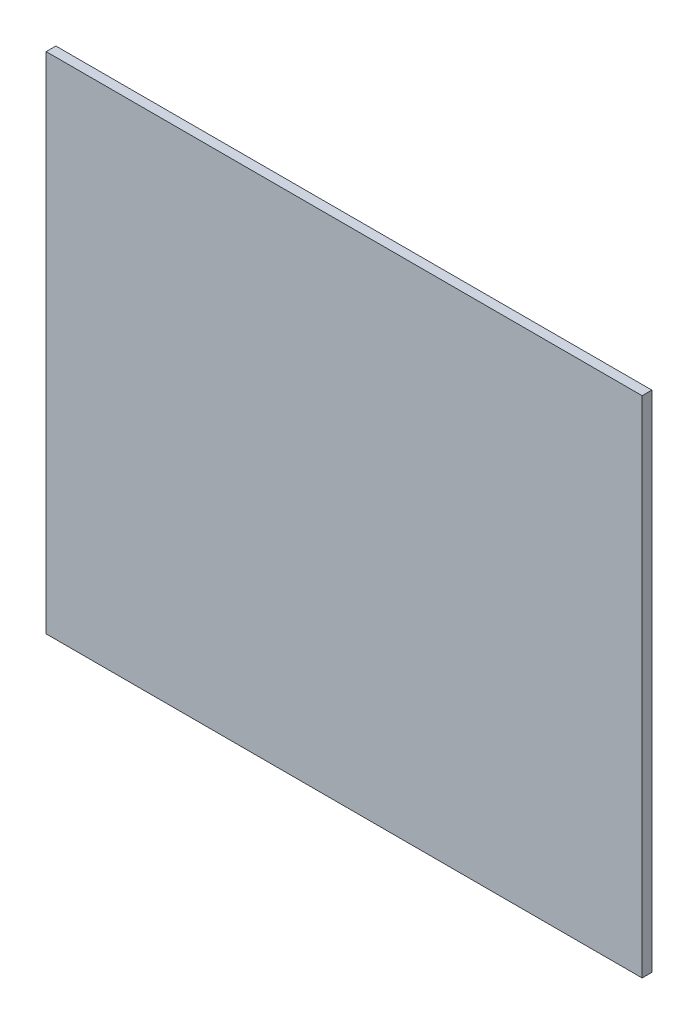
ISO-10303-21;
HEADER;
FILE_DESCRIPTION(('STEP AP214'),'2;1');
FILE_NAME('part.step','',(''),(''),'','','');
FILE_SCHEMA(('AUTOMOTIVE_DESIGN { 1 0 10303 214 1 1 1 1 }'));
ENDSEC;
DATA;
#1=APPLICATION_CONTEXT('core data for automotive mechanical design processes');
#2=APPLICATION_PROTOCOL_DEFINITION('international standard','automotive_design',2000,#1);
#3=PRODUCT_CONTEXT('',#1,'mechanical');
#4=PRODUCT('Part','Part','',(#3));
#5=PRODUCT_RELATED_PRODUCT_CATEGORY('part','',(#4));
#6=PRODUCT_DEFINITION_FORMATION('','',#4);
#7=PRODUCT_DEFINITION_CONTEXT('part definition',#1,'design');
#8=PRODUCT_DEFINITION('design','',#6,#7);
#9=PRODUCT_DEFINITION_SHAPE('','',#8);
#10=(LENGTH_UNIT() NAMED_UNIT(*) SI_UNIT(.MILLI.,.METRE.));
#11=(NAMED_UNIT(*) PLANE_ANGLE_UNIT() SI_UNIT($,.RADIAN.));
#12=(NAMED_UNIT(*) SI_UNIT($,.STERADIAN.) SOLID_ANGLE_UNIT());
#13=UNCERTAINTY_MEASURE_WITH_UNIT(LENGTH_MEASURE(1.E-05),#10,'distance_accuracy_value','');
#14=(GEOMETRIC_REPRESENTATION_CONTEXT(3) GLOBAL_UNCERTAINTY_ASSIGNED_CONTEXT((#13)) GLOBAL_UNIT_ASSIGNED_CONTEXT((#10,
#11,#12)) REPRESENTATION_CONTEXT('',''));
#15=CARTESIAN_POINT('',(0.,0.,0.));
#16=DIRECTION('',(0.,0.,1.));
#17=DIRECTION('',(1.,0.,0.));
#18=AXIS2_PLACEMENT_3D('',#15,#16,#17);
#19=CARTESIAN_POINT('',(0.,0.,6.35));
#20=DIRECTION('',(1.,0.,0.));
#21=DIRECTION('',(0.,0.,-1.));
#22=AXIS2_PLACEMENT_3D('',#19,#20,#21);
#23=PLANE('',#22);
#24=DIRECTION('',(0.,-1.,0.));
#25=VECTOR('',#24,1.);
#26=CARTESIAN_POINT('',(0.,0.,0.));
#27=LINE('',#26,#25);
#28=CARTESIAN_POINT('',(0.,330.,0.));
#29=VERTEX_POINT('',#28);
#30=CARTESIAN_POINT('',(0.,0.,0.));
#31=VERTEX_POINT('',#30);
#32=EDGE_CURVE('E100',#29,#31,#27,.T.);
#33=ORIENTED_EDGE('',*,*,#32,.T.);
#34=DIRECTION('',(0.,0.,-1.));
#35=VECTOR('',#34,1.);
#36=CARTESIAN_POINT('',(0.,0.,6.35));
#37=LINE('',#36,#35);
#38=CARTESIAN_POINT('',(0.,0.,6.35));
#39=VERTEX_POINT('',#38);
#40=EDGE_CURVE('E11',#39,#31,#37,.T.);
#41=ORIENTED_EDGE('',*,*,#40,.F.);
#42=DIRECTION('',(0.,-1.,0.));
#43=VECTOR('',#42,1.);
#44=CARTESIAN_POINT('',(0.,0.,6.35));
#45=LINE('',#44,#43);
#46=CARTESIAN_POINT('',(0.,330.,6.35));
#47=VERTEX_POINT('',#46);
#48=EDGE_CURVE('E88',#47,#39,#45,.T.);
#49=ORIENTED_EDGE('',*,*,#48,.F.);
#50=DIRECTION('',(0.,0.,-1.));
#51=VECTOR('',#50,1.);
#52=CARTESIAN_POINT('',(0.,330.,6.35));
#53=LINE('',#52,#51);
#54=EDGE_CURVE('E96',#47,#29,#53,.T.);
#55=ORIENTED_EDGE('',*,*,#54,.T.);
#56=EDGE_LOOP('',(#33,#41,#49,#55));
#57=FACE_BOUND('',#56,.T.);
#58=ADVANCED_FACE('F37',(#57),#23,.F.);
#59=CARTESIAN_POINT('',(0.,0.,6.35));
#60=DIRECTION('',(0.,1.,0.));
#61=DIRECTION('',(0.,0.,1.));
#62=AXIS2_PLACEMENT_3D('',#59,#60,#61);
#63=PLANE('',#62);
#64=DIRECTION('',(1.,0.,0.));
#65=VECTOR('',#64,1.);
#66=CARTESIAN_POINT('',(0.,0.,0.));
#67=LINE('',#66,#65);
#68=CARTESIAN_POINT('',(390.,0.,0.));
#69=VERTEX_POINT('',#68);
#70=EDGE_CURVE('E92',#31,#69,#67,.T.);
#71=ORIENTED_EDGE('',*,*,#70,.T.);
#72=DIRECTION('',(0.,0.,-1.));
#73=VECTOR('',#72,1.);
#74=CARTESIAN_POINT('',(390.,0.,6.35));
#75=LINE('',#74,#73);
#76=CARTESIAN_POINT('',(390.,0.,6.35));
#77=VERTEX_POINT('',#76);
#78=EDGE_CURVE('E45',#77,#69,#75,.T.);
#79=ORIENTED_EDGE('',*,*,#78,.F.);
#80=DIRECTION('',(1.,0.,0.));
#81=VECTOR('',#80,1.);
#82=CARTESIAN_POINT('',(0.,0.,6.35));
#83=LINE('',#82,#81);
#84=EDGE_CURVE('E83',#39,#77,#83,.T.);
#85=ORIENTED_EDGE('',*,*,#84,.F.);
#86=ORIENTED_EDGE('',*,*,#40,.T.);
#87=EDGE_LOOP('',(#71,#79,#85,#86));
#88=FACE_BOUND('',#87,.T.);
#89=ADVANCED_FACE('F91',(#88),#63,.F.);
#90=CARTESIAN_POINT('',(390.,0.,6.35));
#91=DIRECTION('',(-1.,0.,0.));
#92=DIRECTION('',(0.,0.,1.));
#93=AXIS2_PLACEMENT_3D('',#90,#91,#92);
#94=PLANE('',#93);
#95=DIRECTION('',(0.,1.,0.));
#96=VECTOR('',#95,1.);
#97=CARTESIAN_POINT('',(390.,0.,0.));
#98=LINE('',#97,#96);
#99=CARTESIAN_POINT('',(390.,330.,0.));
#100=VERTEX_POINT('',#99);
#101=EDGE_CURVE('E70',#69,#100,#98,.T.);
#102=ORIENTED_EDGE('',*,*,#101,.T.);
#103=DIRECTION('',(0.,0.,-1.));
#104=VECTOR('',#103,1.);
#105=CARTESIAN_POINT('',(390.,330.,6.35));
#106=LINE('',#105,#104);
#107=CARTESIAN_POINT('',(390.,330.,6.35));
#108=VERTEX_POINT('',#107);
#109=EDGE_CURVE('E93',#108,#100,#106,.T.);
#110=ORIENTED_EDGE('',*,*,#109,.F.);
#111=DIRECTION('',(0.,1.,0.));
#112=VECTOR('',#111,1.);
#113=CARTESIAN_POINT('',(390.,0.,6.35));
#114=LINE('',#113,#112);
#115=EDGE_CURVE('E86',#77,#108,#114,.T.);
#116=ORIENTED_EDGE('',*,*,#115,.F.);
#117=ORIENTED_EDGE('',*,*,#78,.T.);
#118=EDGE_LOOP('',(#102,#110,#116,#117));
#119=FACE_BOUND('',#118,.T.);
#120=ADVANCED_FACE('F94',(#119),#94,.F.);
#121=CARTESIAN_POINT('',(0.,330.,6.35));
#122=DIRECTION('',(0.,-1.,0.));
#123=DIRECTION('',(0.,0.,-1.));
#124=AXIS2_PLACEMENT_3D('',#121,#122,#123);
#125=PLANE('',#124);
#126=DIRECTION('',(-1.,0.,0.));
#127=VECTOR('',#126,1.);
#128=CARTESIAN_POINT('',(0.,330.,0.));
#129=LINE('',#128,#127);
#130=EDGE_CURVE('E76',#100,#29,#129,.T.);
#131=ORIENTED_EDGE('',*,*,#130,.T.);
#132=ORIENTED_EDGE('',*,*,#54,.F.);
#133=DIRECTION('',(-1.,0.,0.));
#134=VECTOR('',#133,1.);
#135=CARTESIAN_POINT('',(0.,330.,6.35));
#136=LINE('',#135,#134);
#137=EDGE_CURVE('E53',#108,#47,#136,.T.);
#138=ORIENTED_EDGE('',*,*,#137,.F.);
#139=ORIENTED_EDGE('',*,*,#109,.T.);
#140=EDGE_LOOP('',(#131,#132,#138,#139));
#141=FACE_BOUND('',#140,.T.);
#142=ADVANCED_FACE('F107',(#141),#125,.F.);
#143=CARTESIAN_POINT('',(0.,0.,6.35));
#144=DIRECTION('',(0.,0.,-1.));
#145=DIRECTION('',(-1.,0.,0.));
#146=AXIS2_PLACEMENT_3D('',#143,#144,#145);
#147=PLANE('',#146);
#148=ORIENTED_EDGE('',*,*,#48,.T.);
#149=ORIENTED_EDGE('',*,*,#84,.T.);
#150=ORIENTED_EDGE('',*,*,#115,.T.);
#151=ORIENTED_EDGE('',*,*,#137,.T.);
#152=EDGE_LOOP('',(#148,#149,#150,#151));
#153=FACE_BOUND('',#152,.T.);
#154=ADVANCED_FACE('F84',(#153),#147,.F.);
#155=CARTESIAN_POINT('',(0.,0.,0.));
#156=DIRECTION('',(0.,0.,-1.));
#157=DIRECTION('',(-1.,0.,0.));
#158=AXIS2_PLACEMENT_3D('',#155,#156,#157);
#159=PLANE('',#158);
#160=ORIENTED_EDGE('',*,*,#32,.F.);
#161=ORIENTED_EDGE('',*,*,#130,.F.);
#162=ORIENTED_EDGE('',*,*,#101,.F.);
#163=ORIENTED_EDGE('',*,*,#70,.F.);
#164=EDGE_LOOP('',(#160,#161,#162,#163));
#165=FACE_BOUND('',#164,.T.);
#166=ADVANCED_FACE('F110',(#165),#159,.T.);
#167=CLOSED_SHELL('',(#58,#89,#120,#142,#154,#166));
#168=MANIFOLD_SOLID_BREP('B2',#167);
#169=ADVANCED_BREP_SHAPE_REPRESENTATION('',(#18,#168),#14);
#170=SHAPE_DEFINITION_REPRESENTATION(#9,#169);
ENDSEC;
END-ISO-10303-21;
